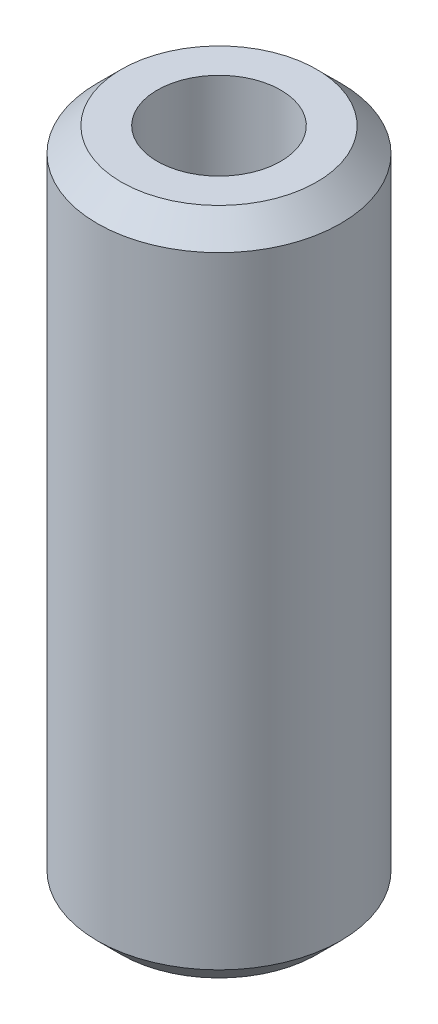
ISO-10303-21;
HEADER;
FILE_DESCRIPTION(('STEP AP214'),'2;1');
FILE_NAME('part.step','',(''),(''),'','','');
FILE_SCHEMA(('AUTOMOTIVE_DESIGN { 1 0 10303 214 1 1 1 1 }'));
ENDSEC;
DATA;
#1=APPLICATION_CONTEXT('core data for automotive mechanical design processes');
#2=APPLICATION_PROTOCOL_DEFINITION('international standard','automotive_design',2000,#1);
#3=PRODUCT_CONTEXT('',#1,'mechanical');
#4=PRODUCT('Part','Part','',(#3));
#5=PRODUCT_RELATED_PRODUCT_CATEGORY('part','',(#4));
#6=PRODUCT_DEFINITION_FORMATION('','',#4);
#7=PRODUCT_DEFINITION_CONTEXT('part definition',#1,'design');
#8=PRODUCT_DEFINITION('design','',#6,#7);
#9=PRODUCT_DEFINITION_SHAPE('','',#8);
#10=(LENGTH_UNIT() NAMED_UNIT(*) SI_UNIT(.MILLI.,.METRE.));
#11=(NAMED_UNIT(*) PLANE_ANGLE_UNIT() SI_UNIT($,.RADIAN.));
#12=(NAMED_UNIT(*) SI_UNIT($,.STERADIAN.) SOLID_ANGLE_UNIT());
#13=UNCERTAINTY_MEASURE_WITH_UNIT(LENGTH_MEASURE(1.E-05),#10,'distance_accuracy_value','');
#14=(GEOMETRIC_REPRESENTATION_CONTEXT(3) GLOBAL_UNCERTAINTY_ASSIGNED_CONTEXT((#13)) GLOBAL_UNIT_ASSIGNED_CONTEXT((#10,
#11,#12)) REPRESENTATION_CONTEXT('',''));
#15=CARTESIAN_POINT('',(0.,0.,0.));
#16=DIRECTION('',(0.,0.,1.));
#17=DIRECTION('',(1.,0.,0.));
#18=AXIS2_PLACEMENT_3D('',#15,#16,#17);
#19=CARTESIAN_POINT('',(0.,69.85,0.));
#20=DIRECTION('',(0.,-1.,0.));
#21=DIRECTION('',(0.,0.,-1.));
#22=AXIS2_PLACEMENT_3D('',#19,#20,#21);
#23=CYLINDRICAL_SURFACE('',#22,12.7);
#24=CARTESIAN_POINT('',(0.,2.5,0.));
#25=DIRECTION('',(0.,1.,0.));
#26=DIRECTION('',(0.,0.,1.));
#27=AXIS2_PLACEMENT_3D('',#24,#25,#26);
#28=CIRCLE('',#27,12.7);
#29=CARTESIAN_POINT('',(0.,2.5,12.7));
#30=VERTEX_POINT('',#29);
#31=EDGE_CURVE('E42',#30,#30,#28,.T.);
#32=ORIENTED_EDGE('',*,*,#31,.T.);
#33=EDGE_LOOP('',(#32));
#34=FACE_BOUND('',#33,.T.);
#35=CARTESIAN_POINT('',(0.,67.35,0.));
#36=DIRECTION('',(0.,1.,0.));
#37=DIRECTION('',(0.,0.,1.));
#38=AXIS2_PLACEMENT_3D('',#35,#36,#37);
#39=CIRCLE('',#38,12.7);
#40=CARTESIAN_POINT('',(0.,67.35,12.7));
#41=VERTEX_POINT('',#40);
#42=EDGE_CURVE('E46',#41,#41,#39,.F.);
#43=ORIENTED_EDGE('',*,*,#42,.T.);
#44=EDGE_LOOP('',(#43));
#45=FACE_BOUND('',#44,.T.);
#46=ADVANCED_FACE('F34',(#34,#45),#23,.T.);
#47=CARTESIAN_POINT('',(0.,69.85,0.));
#48=DIRECTION('',(0.,1.,0.));
#49=DIRECTION('',(0.,0.,1.));
#50=AXIS2_PLACEMENT_3D('',#47,#48,#49);
#51=PLANE('',#50);
#52=CARTESIAN_POINT('',(0.,69.85,0.));
#53=DIRECTION('',(0.,1.,0.));
#54=DIRECTION('',(0.,0.,1.));
#55=AXIS2_PLACEMENT_3D('',#52,#53,#54);
#56=CIRCLE('',#55,10.2);
#57=CARTESIAN_POINT('',(0.,69.85,10.2));
#58=VERTEX_POINT('',#57);
#59=EDGE_CURVE('E50',#58,#58,#56,.T.);
#60=ORIENTED_EDGE('',*,*,#59,.T.);
#61=EDGE_LOOP('',(#60));
#62=FACE_BOUND('',#61,.T.);
#63=CARTESIAN_POINT('',(0.,69.85,0.));
#64=DIRECTION('',(0.,-1.,0.));
#65=DIRECTION('',(0.,0.,-1.));
#66=AXIS2_PLACEMENT_3D('',#63,#64,#65);
#67=CIRCLE('',#66,6.45);
#68=CARTESIAN_POINT('',(0.,69.85,-6.45));
#69=VERTEX_POINT('',#68);
#70=EDGE_CURVE('E55',#69,#69,#67,.T.);
#71=ORIENTED_EDGE('',*,*,#70,.T.);
#72=EDGE_LOOP('',(#71));
#73=FACE_BOUND('',#72,.T.);
#74=ADVANCED_FACE('F62',(#62,#73),#51,.T.);
#75=CARTESIAN_POINT('',(0.,0.,0.));
#76=DIRECTION('',(0.,1.,0.));
#77=DIRECTION('',(0.,0.,1.));
#78=AXIS2_PLACEMENT_3D('',#75,#76,#77);
#79=PLANE('',#78);
#80=CARTESIAN_POINT('',(0.,0.,0.));
#81=DIRECTION('',(0.,1.,0.));
#82=DIRECTION('',(0.,0.,1.));
#83=AXIS2_PLACEMENT_3D('',#80,#81,#82);
#84=CIRCLE('',#83,10.2);
#85=CARTESIAN_POINT('',(0.,0.,10.2));
#86=VERTEX_POINT('',#85);
#87=EDGE_CURVE('E10',#86,#86,#84,.F.);
#88=ORIENTED_EDGE('',*,*,#87,.T.);
#89=EDGE_LOOP('',(#88));
#90=FACE_BOUND('',#89,.T.);
#91=CARTESIAN_POINT('',(0.,0.,0.));
#92=DIRECTION('',(0.,-1.,0.));
#93=DIRECTION('',(0.,0.,-1.));
#94=AXIS2_PLACEMENT_3D('',#91,#92,#93);
#95=CIRCLE('',#94,6.45);
#96=CARTESIAN_POINT('',(0.,0.,-6.45));
#97=VERTEX_POINT('',#96);
#98=EDGE_CURVE('E56',#97,#97,#95,.T.);
#99=ORIENTED_EDGE('',*,*,#98,.F.);
#100=EDGE_LOOP('',(#99));
#101=FACE_BOUND('',#100,.T.);
#102=ADVANCED_FACE('F68',(#90,#101),#79,.F.);
#103=CARTESIAN_POINT('',(0.,69.85,0.));
#104=DIRECTION('',(0.,-1.,0.));
#105=DIRECTION('',(0.,0.,-1.));
#106=AXIS2_PLACEMENT_3D('',#103,#104,#105);
#107=CYLINDRICAL_SURFACE('',#106,6.45);
#108=ORIENTED_EDGE('',*,*,#70,.F.);
#109=EDGE_LOOP('',(#108));
#110=FACE_BOUND('',#109,.T.);
#111=ORIENTED_EDGE('',*,*,#98,.T.);
#112=EDGE_LOOP('',(#111));
#113=FACE_BOUND('',#112,.T.);
#114=ADVANCED_FACE('F64',(#110,#113),#107,.F.);
#115=CARTESIAN_POINT('',(0.,69.85,0.));
#116=DIRECTION('',(0.,-1.,0.));
#117=DIRECTION('',(0.,0.,-1.));
#118=AXIS2_PLACEMENT_3D('',#115,#116,#117);
#119=CONICAL_SURFACE('',#118,10.2,0.785398163397448);
#120=ORIENTED_EDGE('',*,*,#42,.F.);
#121=EDGE_LOOP('',(#120));
#122=FACE_BOUND('',#121,.T.);
#123=ORIENTED_EDGE('',*,*,#59,.F.);
#124=EDGE_LOOP('',(#123));
#125=FACE_BOUND('',#124,.T.);
#126=ADVANCED_FACE('F67',(#122,#125),#119,.T.);
#127=CARTESIAN_POINT('',(0.,2.5,0.));
#128=DIRECTION('',(0.,1.,0.));
#129=DIRECTION('',(0.,0.,1.));
#130=AXIS2_PLACEMENT_3D('',#127,#128,#129);
#131=CONICAL_SURFACE('',#130,12.7,0.785398163397453);
#132=ORIENTED_EDGE('',*,*,#87,.F.);
#133=EDGE_LOOP('',(#132));
#134=FACE_BOUND('',#133,.T.);
#135=ORIENTED_EDGE('',*,*,#31,.F.);
#136=EDGE_LOOP('',(#135));
#137=FACE_BOUND('',#136,.T.);
#138=ADVANCED_FACE('F37',(#134,#137),#131,.T.);
#139=CLOSED_SHELL('',(#46,#74,#102,#114,#126,#138));
#140=MANIFOLD_SOLID_BREP('B2',#139);
#141=ADVANCED_BREP_SHAPE_REPRESENTATION('',(#18,#140),#14);
#142=SHAPE_DEFINITION_REPRESENTATION(#9,#141);
ENDSEC;
END-ISO-10303-21;
